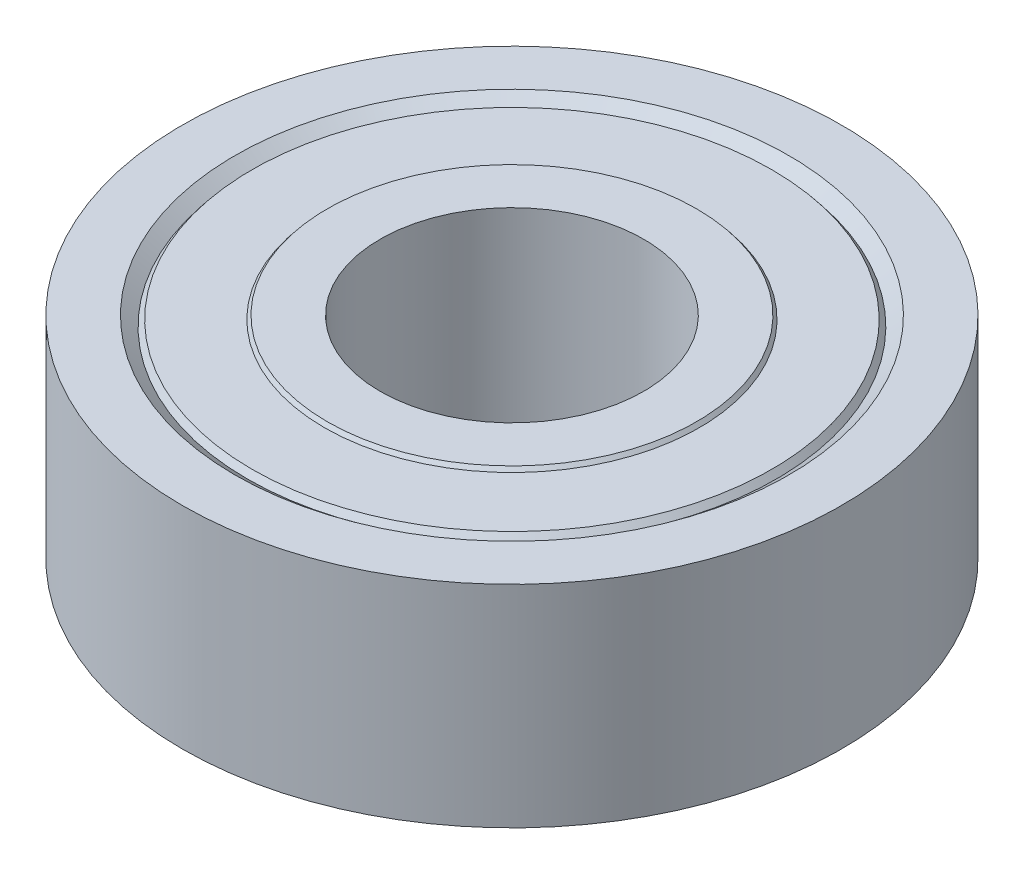
ISO-10303-21;
HEADER;
FILE_DESCRIPTION(('STEP AP214'),'2;1');
FILE_NAME('part.step','',(''),(''),'','','');
FILE_SCHEMA(('AUTOMOTIVE_DESIGN { 1 0 10303 214 1 1 1 1 }'));
ENDSEC;
DATA;
#1=APPLICATION_CONTEXT('core data for automotive mechanical design processes');
#2=APPLICATION_PROTOCOL_DEFINITION('international standard','automotive_design',2000,#1);
#3=PRODUCT_CONTEXT('',#1,'mechanical');
#4=PRODUCT('Part','Part','',(#3));
#5=PRODUCT_RELATED_PRODUCT_CATEGORY('part','',(#4));
#6=PRODUCT_DEFINITION_FORMATION('','',#4);
#7=PRODUCT_DEFINITION_CONTEXT('part definition',#1,'design');
#8=PRODUCT_DEFINITION('design','',#6,#7);
#9=PRODUCT_DEFINITION_SHAPE('','',#8);
#10=(LENGTH_UNIT() NAMED_UNIT(*) SI_UNIT(.MILLI.,.METRE.));
#11=(NAMED_UNIT(*) PLANE_ANGLE_UNIT() SI_UNIT($,.RADIAN.));
#12=(NAMED_UNIT(*) SI_UNIT($,.STERADIAN.) SOLID_ANGLE_UNIT());
#13=UNCERTAINTY_MEASURE_WITH_UNIT(LENGTH_MEASURE(1.E-05),#10,'distance_accuracy_value','');
#14=(GEOMETRIC_REPRESENTATION_CONTEXT(3) GLOBAL_UNCERTAINTY_ASSIGNED_CONTEXT((#13)) GLOBAL_UNIT_ASSIGNED_CONTEXT((#10,
#11,#12)) REPRESENTATION_CONTEXT('',''));
#15=CARTESIAN_POINT('',(0.,0.,0.));
#16=DIRECTION('',(0.,0.,1.));
#17=DIRECTION('',(1.,0.,0.));
#18=AXIS2_PLACEMENT_3D('',#15,#16,#17);
#19=CARTESIAN_POINT('',(0.,0.,0.));
#20=DIRECTION('',(0.,-1.,0.));
#21=DIRECTION('',(0.,0.,-1.));
#22=AXIS2_PLACEMENT_3D('',#19,#20,#21);
#23=CONICAL_SURFACE('',#22,6.6675,0.909222918588365);
#24=CARTESIAN_POINT('',(0.,0.233210480387444,0.));
#25=DIRECTION('',(0.,1.,0.));
#26=DIRECTION('',(0.,0.,1.));
#27=AXIS2_PLACEMENT_3D('',#24,#25,#26);
#28=CIRCLE('',#27,6.36798580089947);
#29=CARTESIAN_POINT('',(0.,0.233210480387444,6.36798580089947));
#30=VERTEX_POINT('',#29);
#31=EDGE_CURVE('E82',#30,#30,#28,.T.);
#32=ORIENTED_EDGE('',*,*,#31,.T.);
#33=EDGE_LOOP('',(#32));
#34=FACE_BOUND('',#33,.T.);
#35=CARTESIAN_POINT('',(0.,0.,0.));
#36=DIRECTION('',(0.,1.,0.));
#37=DIRECTION('',(0.,0.,1.));
#38=AXIS2_PLACEMENT_3D('',#35,#36,#37);
#39=CIRCLE('',#38,6.6675);
#40=CARTESIAN_POINT('',(0.,0.,6.6675));
#41=VERTEX_POINT('',#40);
#42=EDGE_CURVE('E10',#41,#41,#39,.T.);
#43=ORIENTED_EDGE('',*,*,#42,.F.);
#44=EDGE_LOOP('',(#43));
#45=FACE_BOUND('',#44,.T.);
#46=ADVANCED_FACE('F36',(#34,#45),#23,.F.);
#47=CARTESIAN_POINT('',(0.,0.,0.));
#48=DIRECTION('',(0.,1.,0.));
#49=DIRECTION('',(0.,0.,1.));
#50=AXIS2_PLACEMENT_3D('',#47,#48,#49);
#51=PLANE('',#50);
#52=CARTESIAN_POINT('',(0.,0.,0.));
#53=DIRECTION('',(0.,1.,0.));
#54=DIRECTION('',(0.,0.,1.));
#55=AXIS2_PLACEMENT_3D('',#52,#53,#54);
#56=CIRCLE('',#55,7.9375);
#57=CARTESIAN_POINT('',(0.,0.,7.9375));
#58=VERTEX_POINT('',#57);
#59=EDGE_CURVE('E42',#58,#58,#56,.T.);
#60=ORIENTED_EDGE('',*,*,#59,.F.);
#61=EDGE_LOOP('',(#60));
#62=FACE_BOUND('',#61,.T.);
#63=ORIENTED_EDGE('',*,*,#42,.T.);
#64=EDGE_LOOP('',(#63));
#65=FACE_BOUND('',#64,.T.);
#66=ADVANCED_FACE('F100',(#62,#65),#51,.F.);
#67=CARTESIAN_POINT('',(0.,5.08,0.));
#68=DIRECTION('',(0.,1.,0.));
#69=DIRECTION('',(0.,0.,1.));
#70=AXIS2_PLACEMENT_3D('',#67,#68,#69);
#71=CYLINDRICAL_SURFACE('',#70,7.9375);
#72=CARTESIAN_POINT('',(0.,5.08,0.));
#73=DIRECTION('',(0.,1.,0.));
#74=DIRECTION('',(0.,0.,1.));
#75=AXIS2_PLACEMENT_3D('',#72,#73,#74);
#76=CIRCLE('',#75,7.9375);
#77=CARTESIAN_POINT('',(0.,5.08,7.9375));
#78=VERTEX_POINT('',#77);
#79=EDGE_CURVE('E46',#78,#78,#76,.T.);
#80=ORIENTED_EDGE('',*,*,#79,.F.);
#81=EDGE_LOOP('',(#80));
#82=FACE_BOUND('',#81,.T.);
#83=ORIENTED_EDGE('',*,*,#59,.T.);
#84=EDGE_LOOP('',(#83));
#85=FACE_BOUND('',#84,.T.);
#86=ADVANCED_FACE('F104',(#82,#85),#71,.T.);
#87=CARTESIAN_POINT('',(0.,5.08,0.));
#88=DIRECTION('',(0.,-1.,0.));
#89=DIRECTION('',(0.,0.,-1.));
#90=AXIS2_PLACEMENT_3D('',#87,#88,#89);
#91=PLANE('',#90);
#92=CARTESIAN_POINT('',(0.,5.08,0.));
#93=DIRECTION('',(0.,1.,0.));
#94=DIRECTION('',(0.,0.,1.));
#95=AXIS2_PLACEMENT_3D('',#92,#93,#94);
#96=CIRCLE('',#95,6.6675);
#97=CARTESIAN_POINT('',(0.,5.08,6.6675));
#98=VERTEX_POINT('',#97);
#99=EDGE_CURVE('E50',#98,#98,#96,.T.);
#100=ORIENTED_EDGE('',*,*,#99,.F.);
#101=EDGE_LOOP('',(#100));
#102=FACE_BOUND('',#101,.T.);
#103=ORIENTED_EDGE('',*,*,#79,.T.);
#104=EDGE_LOOP('',(#103));
#105=FACE_BOUND('',#104,.T.);
#106=ADVANCED_FACE('F109',(#102,#105),#91,.F.);
#107=CARTESIAN_POINT('',(0.,5.08,0.));
#108=DIRECTION('',(0.,1.,0.));
#109=DIRECTION('',(0.,0.,1.));
#110=AXIS2_PLACEMENT_3D('',#107,#108,#109);
#111=CONICAL_SURFACE('',#110,6.6675,0.909222918588371);
#112=CARTESIAN_POINT('',(0.,4.84678951961256,0.));
#113=DIRECTION('',(0.,1.,0.));
#114=DIRECTION('',(0.,0.,1.));
#115=AXIS2_PLACEMENT_3D('',#112,#113,#114);
#116=CIRCLE('',#115,6.36798580089947);
#117=CARTESIAN_POINT('',(0.,4.84678951961256,6.36798580089947));
#118=VERTEX_POINT('',#117);
#119=EDGE_CURVE('E55',#118,#118,#116,.T.);
#120=ORIENTED_EDGE('',*,*,#119,.F.);
#121=EDGE_LOOP('',(#120));
#122=FACE_BOUND('',#121,.T.);
#123=ORIENTED_EDGE('',*,*,#99,.T.);
#124=EDGE_LOOP('',(#123));
#125=FACE_BOUND('',#124,.T.);
#126=ADVANCED_FACE('F113',(#122,#125),#111,.F.);
#127=CARTESIAN_POINT('',(0.,4.84678951961256,0.));
#128=DIRECTION('',(0.,-1.,0.));
#129=DIRECTION('',(0.,0.,-1.));
#130=AXIS2_PLACEMENT_3D('',#127,#128,#129);
#131=CONICAL_SURFACE('',#130,6.36798580089947,0.661573408206537);
#132=CARTESIAN_POINT('',(0.,4.9918856897293,0.));
#133=DIRECTION('',(0.,1.,0.));
#134=DIRECTION('',(0.,0.,1.));
#135=AXIS2_PLACEMENT_3D('',#132,#133,#134);
#136=CIRCLE('',#135,6.25500969613742);
#137=CARTESIAN_POINT('',(0.,4.9918856897293,6.25500969613742));
#138=VERTEX_POINT('',#137);
#139=EDGE_CURVE('E58',#138,#138,#136,.T.);
#140=ORIENTED_EDGE('',*,*,#139,.F.);
#141=EDGE_LOOP('',(#140));
#142=FACE_BOUND('',#141,.T.);
#143=ORIENTED_EDGE('',*,*,#119,.T.);
#144=EDGE_LOOP('',(#143));
#145=FACE_BOUND('',#144,.T.);
#146=ADVANCED_FACE('F116',(#142,#145),#131,.T.);
#147=CARTESIAN_POINT('',(0.,4.9918856897293,0.));
#148=DIRECTION('',(0.,-1.,0.));
#149=DIRECTION('',(0.,0.,-1.));
#150=AXIS2_PLACEMENT_3D('',#147,#148,#149);
#151=PLANE('',#150);
#152=CARTESIAN_POINT('',(0.,4.9918856897293,0.));
#153=DIRECTION('',(0.,1.,0.));
#154=DIRECTION('',(0.,0.,1.));
#155=AXIS2_PLACEMENT_3D('',#152,#153,#154);
#156=CIRCLE('',#155,4.51521932094721);
#157=CARTESIAN_POINT('',(0.,4.9918856897293,4.51521932094721));
#158=VERTEX_POINT('',#157);
#159=EDGE_CURVE('E61',#158,#158,#156,.T.);
#160=ORIENTED_EDGE('',*,*,#159,.F.);
#161=EDGE_LOOP('',(#160));
#162=FACE_BOUND('',#161,.T.);
#163=ORIENTED_EDGE('',*,*,#139,.T.);
#164=EDGE_LOOP('',(#163));
#165=FACE_BOUND('',#164,.T.);
#166=ADVANCED_FACE('F120',(#162,#165),#151,.F.);
#167=CARTESIAN_POINT('',(0.,4.9918856897293,0.));
#168=DIRECTION('',(0.,-1.,0.));
#169=DIRECTION('',(0.,0.,-1.));
#170=AXIS2_PLACEMENT_3D('',#167,#168,#169);
#171=CONICAL_SURFACE('',#170,4.51521932094721,0.672854966853906);
#172=CARTESIAN_POINT('',(0.,5.08,0.));
#173=DIRECTION('',(0.,1.,0.));
#174=DIRECTION('',(0.,0.,1.));
#175=AXIS2_PLACEMENT_3D('',#172,#173,#174);
#176=CIRCLE('',#175,4.445);
#177=CARTESIAN_POINT('',(0.,5.08,4.445));
#178=VERTEX_POINT('',#177);
#179=EDGE_CURVE('E64',#178,#178,#176,.T.);
#180=ORIENTED_EDGE('',*,*,#179,.F.);
#181=EDGE_LOOP('',(#180));
#182=FACE_BOUND('',#181,.T.);
#183=ORIENTED_EDGE('',*,*,#159,.T.);
#184=EDGE_LOOP('',(#183));
#185=FACE_BOUND('',#184,.T.);
#186=ADVANCED_FACE('F124',(#182,#185),#171,.T.);
#187=CARTESIAN_POINT('',(0.,5.08,0.));
#188=DIRECTION('',(0.,1.,0.));
#189=DIRECTION('',(0.,0.,1.));
#190=AXIS2_PLACEMENT_3D('',#187,#188,#189);
#191=CIRCLE('',#190,3.175);
#192=CARTESIAN_POINT('',(0.,5.08,3.175));
#193=VERTEX_POINT('',#192);
#194=EDGE_CURVE('E67',#193,#193,#191,.T.);
#195=ORIENTED_EDGE('',*,*,#194,.F.);
#196=EDGE_LOOP('',(#195));
#197=FACE_BOUND('',#196,.T.);
#198=ORIENTED_EDGE('',*,*,#179,.T.);
#199=EDGE_LOOP('',(#198));
#200=FACE_BOUND('',#199,.T.);
#201=ADVANCED_FACE('F128',(#197,#200),#91,.F.);
#202=CARTESIAN_POINT('',(0.,5.08,0.));
#203=DIRECTION('',(0.,1.,0.));
#204=DIRECTION('',(0.,0.,1.));
#205=AXIS2_PLACEMENT_3D('',#202,#203,#204);
#206=CYLINDRICAL_SURFACE('',#205,3.175);
#207=ORIENTED_EDGE('',*,*,#194,.T.);
#208=EDGE_LOOP('',(#207));
#209=FACE_BOUND('',#208,.T.);
#210=CARTESIAN_POINT('',(0.,0.,0.));
#211=DIRECTION('',(0.,1.,0.));
#212=DIRECTION('',(0.,0.,1.));
#213=AXIS2_PLACEMENT_3D('',#210,#211,#212);
#214=CIRCLE('',#213,3.175);
#215=CARTESIAN_POINT('',(0.,0.,3.175));
#216=VERTEX_POINT('',#215);
#217=EDGE_CURVE('E70',#216,#216,#214,.T.);
#218=ORIENTED_EDGE('',*,*,#217,.F.);
#219=EDGE_LOOP('',(#218));
#220=FACE_BOUND('',#219,.T.);
#221=ADVANCED_FACE('F132',(#209,#220),#206,.F.);
#222=CARTESIAN_POINT('',(0.,0.,0.));
#223=DIRECTION('',(0.,1.,0.));
#224=DIRECTION('',(0.,0.,1.));
#225=AXIS2_PLACEMENT_3D('',#222,#223,#224);
#226=PLANE('',#225);
#227=CARTESIAN_POINT('',(0.,0.,0.));
#228=DIRECTION('',(0.,1.,0.));
#229=DIRECTION('',(0.,0.,1.));
#230=AXIS2_PLACEMENT_3D('',#227,#228,#229);
#231=CIRCLE('',#230,4.445);
#232=CARTESIAN_POINT('',(0.,0.,4.445));
#233=VERTEX_POINT('',#232);
#234=EDGE_CURVE('E73',#233,#233,#231,.T.);
#235=ORIENTED_EDGE('',*,*,#234,.F.);
#236=EDGE_LOOP('',(#235));
#237=FACE_BOUND('',#236,.T.);
#238=ORIENTED_EDGE('',*,*,#217,.T.);
#239=EDGE_LOOP('',(#238));
#240=FACE_BOUND('',#239,.T.);
#241=ADVANCED_FACE('F136',(#237,#240),#226,.F.);
#242=CARTESIAN_POINT('',(0.,0.0881143102707,0.));
#243=DIRECTION('',(0.,1.,0.));
#244=DIRECTION('',(0.,0.,1.));
#245=AXIS2_PLACEMENT_3D('',#242,#243,#244);
#246=CONICAL_SURFACE('',#245,4.51521932094721,0.672854966853906);
#247=ORIENTED_EDGE('',*,*,#234,.T.);
#248=EDGE_LOOP('',(#247));
#249=FACE_BOUND('',#248,.T.);
#250=CARTESIAN_POINT('',(0.,0.0881143102707,0.));
#251=DIRECTION('',(0.,1.,0.));
#252=DIRECTION('',(0.,0.,1.));
#253=AXIS2_PLACEMENT_3D('',#250,#251,#252);
#254=CIRCLE('',#253,4.51521932094721);
#255=CARTESIAN_POINT('',(0.,0.0881143102707,4.51521932094721));
#256=VERTEX_POINT('',#255);
#257=EDGE_CURVE('E76',#256,#256,#254,.T.);
#258=ORIENTED_EDGE('',*,*,#257,.F.);
#259=EDGE_LOOP('',(#258));
#260=FACE_BOUND('',#259,.T.);
#261=ADVANCED_FACE('F96',(#249,#260),#246,.T.);
#262=CARTESIAN_POINT('',(0.,0.0881143102707,0.));
#263=DIRECTION('',(0.,-1.,0.));
#264=DIRECTION('',(0.,0.,-1.));
#265=AXIS2_PLACEMENT_3D('',#262,#263,#264);
#266=PLANE('',#265);
#267=ORIENTED_EDGE('',*,*,#257,.T.);
#268=EDGE_LOOP('',(#267));
#269=FACE_BOUND('',#268,.T.);
#270=CARTESIAN_POINT('',(0.,0.0881143102707,0.));
#271=DIRECTION('',(0.,1.,0.));
#272=DIRECTION('',(0.,0.,1.));
#273=AXIS2_PLACEMENT_3D('',#270,#271,#272);
#274=CIRCLE('',#273,6.25500969613742);
#275=CARTESIAN_POINT('',(0.,0.0881143102707,6.25500969613742));
#276=VERTEX_POINT('',#275);
#277=EDGE_CURVE('E79',#276,#276,#274,.T.);
#278=ORIENTED_EDGE('',*,*,#277,.F.);
#279=EDGE_LOOP('',(#278));
#280=FACE_BOUND('',#279,.T.);
#281=ADVANCED_FACE('F90',(#269,#280),#266,.T.);
#282=CARTESIAN_POINT('',(0.,0.233210480387444,0.));
#283=DIRECTION('',(0.,1.,0.));
#284=DIRECTION('',(0.,0.,1.));
#285=AXIS2_PLACEMENT_3D('',#282,#283,#284);
#286=CONICAL_SURFACE('',#285,6.36798580089947,0.66157340820653);
#287=ORIENTED_EDGE('',*,*,#277,.T.);
#288=EDGE_LOOP('',(#287));
#289=FACE_BOUND('',#288,.T.);
#290=ORIENTED_EDGE('',*,*,#31,.F.);
#291=EDGE_LOOP('',(#290));
#292=FACE_BOUND('',#291,.T.);
#293=ADVANCED_FACE('F88',(#289,#292),#286,.T.);
#294=CLOSED_SHELL('',(#46,#66,#86,#106,#126,#146,#166,#186,#201,#221,#241,#261,#281,#293));
#295=MANIFOLD_SOLID_BREP('B2',#294);
#296=ADVANCED_BREP_SHAPE_REPRESENTATION('',(#18,#295),#14);
#297=SHAPE_DEFINITION_REPRESENTATION(#9,#296);
ENDSEC;
END-ISO-10303-21;
